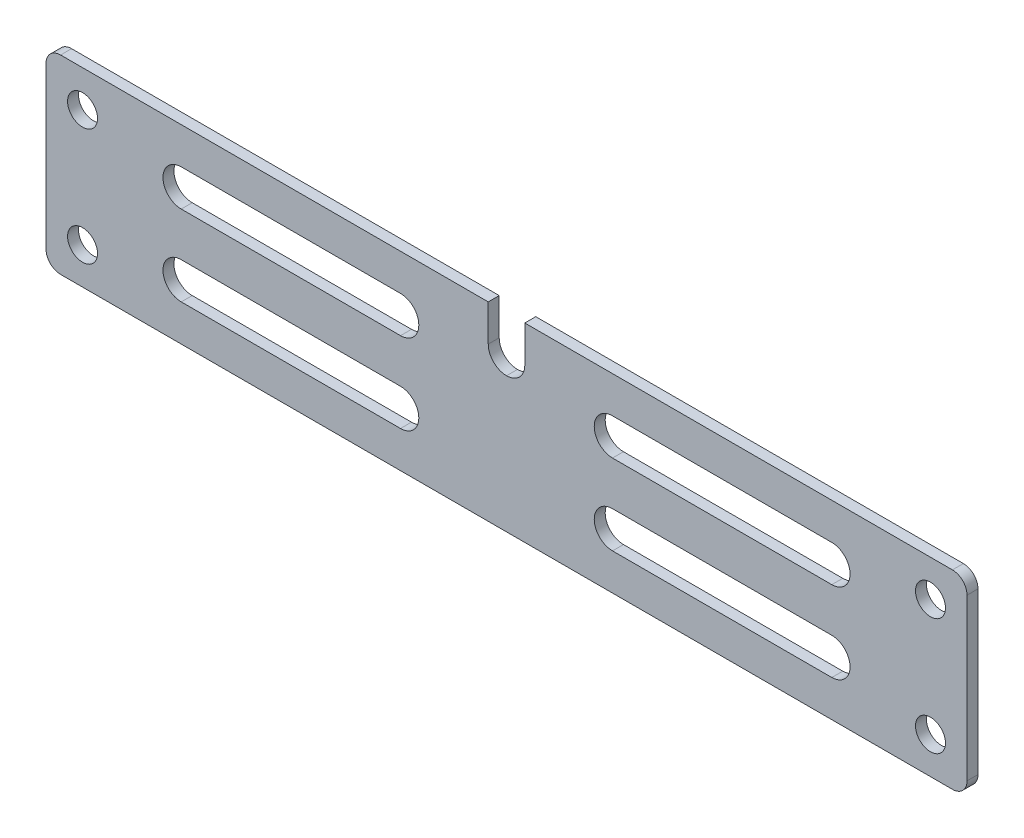
ISO-10303-21;
HEADER;
FILE_DESCRIPTION(('STEP AP214'),'2;1');
FILE_NAME('part.step','',(''),(''),'','','');
FILE_SCHEMA(('AUTOMOTIVE_DESIGN { 1 0 10303 214 1 1 1 1 }'));
ENDSEC;
DATA;
#1=APPLICATION_CONTEXT('core data for automotive mechanical design processes');
#2=APPLICATION_PROTOCOL_DEFINITION('international standard','automotive_design',2000,#1);
#3=PRODUCT_CONTEXT('',#1,'mechanical');
#4=PRODUCT('Part','Part','',(#3));
#5=PRODUCT_RELATED_PRODUCT_CATEGORY('part','',(#4));
#6=PRODUCT_DEFINITION_FORMATION('','',#4);
#7=PRODUCT_DEFINITION_CONTEXT('part definition',#1,'design');
#8=PRODUCT_DEFINITION('design','',#6,#7);
#9=PRODUCT_DEFINITION_SHAPE('','',#8);
#10=(LENGTH_UNIT() NAMED_UNIT(*) SI_UNIT(.MILLI.,.METRE.));
#11=(NAMED_UNIT(*) PLANE_ANGLE_UNIT() SI_UNIT($,.RADIAN.));
#12=(NAMED_UNIT(*) SI_UNIT($,.STERADIAN.) SOLID_ANGLE_UNIT());
#13=UNCERTAINTY_MEASURE_WITH_UNIT(LENGTH_MEASURE(1.E-05),#10,'distance_accuracy_value','');
#14=(GEOMETRIC_REPRESENTATION_CONTEXT(3) GLOBAL_UNCERTAINTY_ASSIGNED_CONTEXT((#13)) GLOBAL_UNIT_ASSIGNED_CONTEXT((#10,
#11,#12)) REPRESENTATION_CONTEXT('',''));
#15=CARTESIAN_POINT('',(0.,0.,0.));
#16=DIRECTION('',(0.,0.,1.));
#17=DIRECTION('',(1.,0.,0.));
#18=AXIS2_PLACEMENT_3D('',#15,#16,#17);
#19=CARTESIAN_POINT('',(63.,13.,1.5));
#20=DIRECTION('',(0.,-1.,0.));
#21=DIRECTION('',(1.,0.,0.));
#22=AXIS2_PLACEMENT_3D('',#19,#20,#21);
#23=PLANE('',#22);
#24=DIRECTION('',(-1.,0.,0.));
#25=VECTOR('',#24,1.);
#26=CARTESIAN_POINT('',(63.,13.,0.));
#27=LINE('',#26,#25);
#28=CARTESIAN_POINT('',(61.,13.,0.));
#29=VERTEX_POINT('',#28);
#30=CARTESIAN_POINT('',(2.5,13.,0.));
#31=VERTEX_POINT('',#30);
#32=EDGE_CURVE('E434',#29,#31,#27,.T.);
#33=ORIENTED_EDGE('',*,*,#32,.T.);
#34=DIRECTION('',(0.,0.,1.));
#35=VECTOR('',#34,1.);
#36=CARTESIAN_POINT('',(2.5,13.,1.5));
#37=LINE('',#36,#35);
#38=CARTESIAN_POINT('',(2.5,13.,1.5));
#39=VERTEX_POINT('',#38);
#40=EDGE_CURVE('E520',#31,#39,#37,.T.);
#41=ORIENTED_EDGE('',*,*,#40,.T.);
#42=DIRECTION('',(-1.,0.,0.));
#43=VECTOR('',#42,1.);
#44=CARTESIAN_POINT('',(63.,13.,1.5));
#45=LINE('',#44,#43);
#46=CARTESIAN_POINT('',(61.,13.,1.5));
#47=VERTEX_POINT('',#46);
#48=EDGE_CURVE('E441',#47,#39,#45,.T.);
#49=ORIENTED_EDGE('',*,*,#48,.F.);
#50=DIRECTION('',(0.,0.,-1.));
#51=VECTOR('',#50,1.);
#52=CARTESIAN_POINT('',(61.,13.,1.5));
#53=LINE('',#52,#51);
#54=EDGE_CURVE('E470',#47,#29,#53,.T.);
#55=ORIENTED_EDGE('',*,*,#54,.T.);
#56=EDGE_LOOP('',(#33,#41,#49,#55));
#57=FACE_BOUND('',#56,.T.);
#58=ADVANCED_FACE('F44',(#57),#23,.F.);
#59=CARTESIAN_POINT('',(-63.,-13.,1.5));
#60=DIRECTION('',(1.,0.,0.));
#61=DIRECTION('',(0.,0.,-1.));
#62=AXIS2_PLACEMENT_3D('',#59,#60,#61);
#63=PLANE('',#62);
#64=DIRECTION('',(0.,-1.,0.));
#65=VECTOR('',#64,1.);
#66=CARTESIAN_POINT('',(-63.,-13.,0.));
#67=LINE('',#66,#65);
#68=CARTESIAN_POINT('',(-63.,11.,0.));
#69=VERTEX_POINT('',#68);
#70=CARTESIAN_POINT('',(-63.,-11.,0.));
#71=VERTEX_POINT('',#70);
#72=EDGE_CURVE('E425',#69,#71,#67,.T.);
#73=ORIENTED_EDGE('',*,*,#72,.T.);
#74=DIRECTION('',(0.,0.,-1.));
#75=VECTOR('',#74,1.);
#76=CARTESIAN_POINT('',(-63.,-11.,1.5));
#77=LINE('',#76,#75);
#78=CARTESIAN_POINT('',(-63.,-11.,1.5));
#79=VERTEX_POINT('',#78);
#80=EDGE_CURVE('E416',#71,#79,#77,.F.);
#81=ORIENTED_EDGE('',*,*,#80,.T.);
#82=DIRECTION('',(0.,-1.,0.));
#83=VECTOR('',#82,1.);
#84=CARTESIAN_POINT('',(-63.,-13.,1.5));
#85=LINE('',#84,#83);
#86=CARTESIAN_POINT('',(-63.,11.,1.5));
#87=VERTEX_POINT('',#86);
#88=EDGE_CURVE('E429',#87,#79,#85,.T.);
#89=ORIENTED_EDGE('',*,*,#88,.F.);
#90=DIRECTION('',(0.,0.,-1.));
#91=VECTOR('',#90,1.);
#92=CARTESIAN_POINT('',(-63.,11.,1.5));
#93=LINE('',#92,#91);
#94=EDGE_CURVE('E509',#87,#69,#93,.T.);
#95=ORIENTED_EDGE('',*,*,#94,.T.);
#96=EDGE_LOOP('',(#73,#81,#89,#95));
#97=FACE_BOUND('',#96,.T.);
#98=ADVANCED_FACE('F594',(#97),#63,.F.);
#99=CARTESIAN_POINT('',(63.,-13.,1.5));
#100=DIRECTION('',(0.,1.,0.));
#101=DIRECTION('',(-1.,0.,0.));
#102=AXIS2_PLACEMENT_3D('',#99,#100,#101);
#103=PLANE('',#102);
#104=DIRECTION('',(1.,0.,0.));
#105=VECTOR('',#104,1.);
#106=CARTESIAN_POINT('',(63.,-13.,0.));
#107=LINE('',#106,#105);
#108=CARTESIAN_POINT('',(-61.,-13.,0.));
#109=VERTEX_POINT('',#108);
#110=CARTESIAN_POINT('',(61.,-13.,0.));
#111=VERTEX_POINT('',#110);
#112=EDGE_CURVE('E455',#109,#111,#107,.T.);
#113=ORIENTED_EDGE('',*,*,#112,.T.);
#114=DIRECTION('',(0.,0.,-1.));
#115=VECTOR('',#114,1.);
#116=CARTESIAN_POINT('',(61.,-13.,1.5));
#117=LINE('',#116,#115);
#118=CARTESIAN_POINT('',(61.,-13.,1.5));
#119=VERTEX_POINT('',#118);
#120=EDGE_CURVE('E510',#111,#119,#117,.F.);
#121=ORIENTED_EDGE('',*,*,#120,.T.);
#122=DIRECTION('',(1.,0.,0.));
#123=VECTOR('',#122,1.);
#124=CARTESIAN_POINT('',(63.,-13.,1.5));
#125=LINE('',#124,#123);
#126=CARTESIAN_POINT('',(-61.,-13.,1.5));
#127=VERTEX_POINT('',#126);
#128=EDGE_CURVE('E432',#127,#119,#125,.T.);
#129=ORIENTED_EDGE('',*,*,#128,.F.);
#130=DIRECTION('',(0.,0.,-1.));
#131=VECTOR('',#130,1.);
#132=CARTESIAN_POINT('',(-61.,-13.,1.5));
#133=LINE('',#132,#131);
#134=EDGE_CURVE('E502',#127,#109,#133,.T.);
#135=ORIENTED_EDGE('',*,*,#134,.T.);
#136=EDGE_LOOP('',(#113,#121,#129,#135));
#137=FACE_BOUND('',#136,.T.);
#138=ADVANCED_FACE('F588',(#137),#103,.F.);
#139=CARTESIAN_POINT('',(63.,-13.,1.5));
#140=DIRECTION('',(-1.,0.,0.));
#141=DIRECTION('',(0.,0.,1.));
#142=AXIS2_PLACEMENT_3D('',#139,#140,#141);
#143=PLANE('',#142);
#144=DIRECTION('',(0.,1.,0.));
#145=VECTOR('',#144,1.);
#146=CARTESIAN_POINT('',(63.,-13.,0.));
#147=LINE('',#146,#145);
#148=CARTESIAN_POINT('',(63.,-11.,0.));
#149=VERTEX_POINT('',#148);
#150=CARTESIAN_POINT('',(63.,11.,0.));
#151=VERTEX_POINT('',#150);
#152=EDGE_CURVE('E457',#149,#151,#147,.T.);
#153=ORIENTED_EDGE('',*,*,#152,.T.);
#154=DIRECTION('',(0.,0.,-1.));
#155=VECTOR('',#154,1.);
#156=CARTESIAN_POINT('',(63.,11.,1.5));
#157=LINE('',#156,#155);
#158=CARTESIAN_POINT('',(63.,11.,1.5));
#159=VERTEX_POINT('',#158);
#160=EDGE_CURVE('E488',#151,#159,#157,.F.);
#161=ORIENTED_EDGE('',*,*,#160,.T.);
#162=DIRECTION('',(0.,1.,0.));
#163=VECTOR('',#162,1.);
#164=CARTESIAN_POINT('',(63.,-13.,1.5));
#165=LINE('',#164,#163);
#166=CARTESIAN_POINT('',(63.,-11.,1.5));
#167=VERTEX_POINT('',#166);
#168=EDGE_CURVE('E438',#167,#159,#165,.T.);
#169=ORIENTED_EDGE('',*,*,#168,.F.);
#170=DIRECTION('',(0.,0.,-1.));
#171=VECTOR('',#170,1.);
#172=CARTESIAN_POINT('',(63.,-11.,1.5));
#173=LINE('',#172,#171);
#174=EDGE_CURVE('E482',#167,#149,#173,.T.);
#175=ORIENTED_EDGE('',*,*,#174,.T.);
#176=EDGE_LOOP('',(#153,#161,#169,#175));
#177=FACE_BOUND('',#176,.T.);
#178=ADVANCED_FACE('F580',(#177),#143,.F.);
#179=CARTESIAN_POINT('',(-2.5,13.,1.5));
#180=VERTEX_POINT('',#179);
#181=CARTESIAN_POINT('',(-61.,13.,1.5));
#182=VERTEX_POINT('',#181);
#183=EDGE_CURVE('E444',#180,#182,#45,.T.);
#184=ORIENTED_EDGE('',*,*,#183,.F.);
#185=DIRECTION('',(0.,0.,-1.));
#186=VECTOR('',#185,1.);
#187=CARTESIAN_POINT('',(-2.5,13.,1.5));
#188=LINE('',#187,#186);
#189=CARTESIAN_POINT('',(-2.5,13.,0.));
#190=VERTEX_POINT('',#189);
#191=EDGE_CURVE('E430',#180,#190,#188,.T.);
#192=ORIENTED_EDGE('',*,*,#191,.T.);
#193=CARTESIAN_POINT('',(-61.,13.,0.));
#194=VERTEX_POINT('',#193);
#195=EDGE_CURVE('E458',#190,#194,#27,.T.);
#196=ORIENTED_EDGE('',*,*,#195,.T.);
#197=DIRECTION('',(0.,0.,-1.));
#198=VECTOR('',#197,1.);
#199=CARTESIAN_POINT('',(-61.,13.,1.5));
#200=LINE('',#199,#198);
#201=EDGE_CURVE('E447',#194,#182,#200,.F.);
#202=ORIENTED_EDGE('',*,*,#201,.T.);
#203=EDGE_LOOP('',(#184,#192,#196,#202));
#204=FACE_BOUND('',#203,.T.);
#205=ADVANCED_FACE('F553',(#204),#23,.F.);
#206=CARTESIAN_POINT('',(0.,0.,1.5));
#207=DIRECTION('',(0.,0.,1.));
#208=DIRECTION('',(1.,0.,0.));
#209=AXIS2_PLACEMENT_3D('',#206,#207,#208);
#210=PLANE('',#209);
#211=CARTESIAN_POINT('',(-58.,-7.99999999999999,1.5));
#212=DIRECTION('',(0.,0.,1.));
#213=DIRECTION('',(1.,0.,0.));
#214=AXIS2_PLACEMENT_3D('',#211,#212,#213);
#215=CIRCLE('',#214,2.05);
#216=CARTESIAN_POINT('',(-55.95,-7.99999999999999,1.5));
#217=VERTEX_POINT('',#216);
#218=EDGE_CURVE('E930',#217,#217,#215,.T.);
#219=ORIENTED_EDGE('',*,*,#218,.F.);
#220=EDGE_LOOP('',(#219));
#221=FACE_BOUND('',#220,.T.);
#222=CARTESIAN_POINT('',(-58.,7.99999999999997,1.5));
#223=DIRECTION('',(0.,0.,1.));
#224=DIRECTION('',(1.,0.,0.));
#225=AXIS2_PLACEMENT_3D('',#222,#223,#224);
#226=CIRCLE('',#225,2.05);
#227=CARTESIAN_POINT('',(-55.95,7.99999999999997,1.5));
#228=VERTEX_POINT('',#227);
#229=EDGE_CURVE('E932',#228,#228,#226,.T.);
#230=ORIENTED_EDGE('',*,*,#229,.F.);
#231=EDGE_LOOP('',(#230));
#232=FACE_BOUND('',#231,.T.);
#233=CARTESIAN_POINT('',(58.,8.,1.5));
#234=DIRECTION('',(0.,0.,1.));
#235=DIRECTION('',(1.,0.,0.));
#236=AXIS2_PLACEMENT_3D('',#233,#234,#235);
#237=CIRCLE('',#236,2.05);
#238=CARTESIAN_POINT('',(60.05,8.,1.5));
#239=VERTEX_POINT('',#238);
#240=EDGE_CURVE('E925',#239,#239,#237,.T.);
#241=ORIENTED_EDGE('',*,*,#240,.F.);
#242=EDGE_LOOP('',(#241));
#243=FACE_BOUND('',#242,.T.);
#244=CARTESIAN_POINT('',(58.,-7.99999999999999,1.5));
#245=DIRECTION('',(0.,0.,1.));
#246=DIRECTION('',(1.,0.,0.));
#247=AXIS2_PLACEMENT_3D('',#244,#245,#246);
#248=CIRCLE('',#247,2.05);
#249=CARTESIAN_POINT('',(60.05,-7.99999999999999,1.5));
#250=VERTEX_POINT('',#249);
#251=EDGE_CURVE('E916',#250,#250,#248,.T.);
#252=ORIENTED_EDGE('',*,*,#251,.F.);
#253=EDGE_LOOP('',(#252));
#254=FACE_BOUND('',#253,.T.);
#255=CARTESIAN_POINT('',(-44.5,-5.5,1.5));
#256=DIRECTION('',(0.,0.,1.));
#257=DIRECTION('',(1.,0.,0.));
#258=AXIS2_PLACEMENT_3D('',#255,#256,#257);
#259=CIRCLE('',#258,2.5);
#260=CARTESIAN_POINT('',(-44.5,-3.,1.5));
#261=VERTEX_POINT('',#260);
#262=CARTESIAN_POINT('',(-44.5,-8.,1.5));
#263=VERTEX_POINT('',#262);
#264=EDGE_CURVE('E64',#261,#263,#259,.T.);
#265=ORIENTED_EDGE('',*,*,#264,.F.);
#266=DIRECTION('',(-1.,0.,0.));
#267=VECTOR('',#266,1.);
#268=CARTESIAN_POINT('',(-44.5,-3.,1.5));
#269=LINE('',#268,#267);
#270=CARTESIAN_POINT('',(-14.5,-3.,1.5));
#271=VERTEX_POINT('',#270);
#272=EDGE_CURVE('E342',#271,#261,#269,.T.);
#273=ORIENTED_EDGE('',*,*,#272,.F.);
#274=CARTESIAN_POINT('',(-14.5,-5.5,1.5));
#275=DIRECTION('',(0.,0.,1.));
#276=DIRECTION('',(1.,0.,0.));
#277=AXIS2_PLACEMENT_3D('',#274,#275,#276);
#278=CIRCLE('',#277,2.5);
#279=CARTESIAN_POINT('',(-14.5,-8.,1.5));
#280=VERTEX_POINT('',#279);
#281=EDGE_CURVE('E346',#280,#271,#278,.T.);
#282=ORIENTED_EDGE('',*,*,#281,.F.);
#283=DIRECTION('',(1.,0.,0.));
#284=VECTOR('',#283,1.);
#285=CARTESIAN_POINT('',(-44.5,-8.,1.5));
#286=LINE('',#285,#284);
#287=EDGE_CURVE('E352',#263,#280,#286,.T.);
#288=ORIENTED_EDGE('',*,*,#287,.F.);
#289=EDGE_LOOP('',(#265,#273,#282,#288));
#290=FACE_BOUND('',#289,.T.);
#291=CARTESIAN_POINT('',(14.5,-5.5,1.5));
#292=DIRECTION('',(0.,0.,1.));
#293=DIRECTION('',(1.,0.,0.));
#294=AXIS2_PLACEMENT_3D('',#291,#292,#293);
#295=CIRCLE('',#294,2.5);
#296=CARTESIAN_POINT('',(14.5,-3.,1.5));
#297=VERTEX_POINT('',#296);
#298=CARTESIAN_POINT('',(14.5,-8.,1.5));
#299=VERTEX_POINT('',#298);
#300=EDGE_CURVE('E69',#297,#299,#295,.T.);
#301=ORIENTED_EDGE('',*,*,#300,.F.);
#302=DIRECTION('',(-1.,0.,0.));
#303=VECTOR('',#302,1.);
#304=CARTESIAN_POINT('',(14.5,-3.,1.5));
#305=LINE('',#304,#303);
#306=CARTESIAN_POINT('',(44.5,-3.,1.5));
#307=VERTEX_POINT('',#306);
#308=EDGE_CURVE('E303',#307,#297,#305,.T.);
#309=ORIENTED_EDGE('',*,*,#308,.F.);
#310=CARTESIAN_POINT('',(44.5,-5.5,1.5));
#311=DIRECTION('',(0.,0.,1.));
#312=DIRECTION('',(1.,0.,0.));
#313=AXIS2_PLACEMENT_3D('',#310,#311,#312);
#314=CIRCLE('',#313,2.5);
#315=CARTESIAN_POINT('',(44.5,-8.,1.5));
#316=VERTEX_POINT('',#315);
#317=EDGE_CURVE('E304',#316,#307,#314,.T.);
#318=ORIENTED_EDGE('',*,*,#317,.F.);
#319=DIRECTION('',(1.,0.,0.));
#320=VECTOR('',#319,1.);
#321=CARTESIAN_POINT('',(14.5,-8.,1.5));
#322=LINE('',#321,#320);
#323=EDGE_CURVE('E309',#299,#316,#322,.T.);
#324=ORIENTED_EDGE('',*,*,#323,.F.);
#325=EDGE_LOOP('',(#301,#309,#318,#324));
#326=FACE_BOUND('',#325,.T.);
#327=CARTESIAN_POINT('',(14.5,5.5,1.5));
#328=DIRECTION('',(0.,0.,1.));
#329=DIRECTION('',(1.,0.,0.));
#330=AXIS2_PLACEMENT_3D('',#327,#328,#329);
#331=CIRCLE('',#330,2.5);
#332=CARTESIAN_POINT('',(14.5,8.,1.5));
#333=VERTEX_POINT('',#332);
#334=CARTESIAN_POINT('',(14.5,3.,1.5));
#335=VERTEX_POINT('',#334);
#336=EDGE_CURVE('E238',#333,#335,#331,.T.);
#337=ORIENTED_EDGE('',*,*,#336,.F.);
#338=DIRECTION('',(-1.,0.,0.));
#339=VECTOR('',#338,1.);
#340=CARTESIAN_POINT('',(14.5,8.,1.5));
#341=LINE('',#340,#339);
#342=CARTESIAN_POINT('',(44.5,8.,1.5));
#343=VERTEX_POINT('',#342);
#344=EDGE_CURVE('E253',#343,#333,#341,.T.);
#345=ORIENTED_EDGE('',*,*,#344,.F.);
#346=CARTESIAN_POINT('',(44.5,5.5,1.5));
#347=DIRECTION('',(0.,0.,1.));
#348=DIRECTION('',(1.,0.,0.));
#349=AXIS2_PLACEMENT_3D('',#346,#347,#348);
#350=CIRCLE('',#349,2.5);
#351=CARTESIAN_POINT('',(44.5,3.,1.5));
#352=VERTEX_POINT('',#351);
#353=EDGE_CURVE('E260',#352,#343,#350,.T.);
#354=ORIENTED_EDGE('',*,*,#353,.F.);
#355=DIRECTION('',(1.,0.,0.));
#356=VECTOR('',#355,1.);
#357=CARTESIAN_POINT('',(14.5,3.,1.5));
#358=LINE('',#357,#356);
#359=EDGE_CURVE('E263',#335,#352,#358,.T.);
#360=ORIENTED_EDGE('',*,*,#359,.F.);
#361=EDGE_LOOP('',(#337,#345,#354,#360));
#362=FACE_BOUND('',#361,.T.);
#363=CARTESIAN_POINT('',(-44.5,5.5,1.5));
#364=DIRECTION('',(0.,0.,1.));
#365=DIRECTION('',(1.,0.,0.));
#366=AXIS2_PLACEMENT_3D('',#363,#364,#365);
#367=CIRCLE('',#366,2.5);
#368=CARTESIAN_POINT('',(-44.5,8.,1.5));
#369=VERTEX_POINT('',#368);
#370=CARTESIAN_POINT('',(-44.5,3.,1.5));
#371=VERTEX_POINT('',#370);
#372=EDGE_CURVE('E264',#369,#371,#367,.T.);
#373=ORIENTED_EDGE('',*,*,#372,.F.);
#374=DIRECTION('',(-1.,0.,0.));
#375=VECTOR('',#374,1.);
#376=CARTESIAN_POINT('',(-44.5,8.,1.5));
#377=LINE('',#376,#375);
#378=CARTESIAN_POINT('',(-14.5,8.,1.5));
#379=VERTEX_POINT('',#378);
#380=EDGE_CURVE('E378',#379,#369,#377,.T.);
#381=ORIENTED_EDGE('',*,*,#380,.F.);
#382=CARTESIAN_POINT('',(-14.5,5.5,1.5));
#383=DIRECTION('',(0.,0.,1.));
#384=DIRECTION('',(1.,0.,0.));
#385=AXIS2_PLACEMENT_3D('',#382,#383,#384);
#386=CIRCLE('',#385,2.5);
#387=CARTESIAN_POINT('',(-14.5,3.,1.5));
#388=VERTEX_POINT('',#387);
#389=EDGE_CURVE('E395',#388,#379,#386,.T.);
#390=ORIENTED_EDGE('',*,*,#389,.F.);
#391=DIRECTION('',(1.,0.,0.));
#392=VECTOR('',#391,1.);
#393=CARTESIAN_POINT('',(-44.5,3.,1.5));
#394=LINE('',#393,#392);
#395=EDGE_CURVE('E267',#371,#388,#394,.T.);
#396=ORIENTED_EDGE('',*,*,#395,.F.);
#397=EDGE_LOOP('',(#373,#381,#390,#396));
#398=FACE_BOUND('',#397,.T.);
#399=DIRECTION('',(0.,-1.,0.));
#400=VECTOR('',#399,1.);
#401=CARTESIAN_POINT('',(-2.5,5.50000000000002,1.5));
#402=LINE('',#401,#400);
#403=CARTESIAN_POINT('',(-2.5,8.00000000000002,1.5));
#404=VERTEX_POINT('',#403);
#405=EDGE_CURVE('E417',#180,#404,#402,.T.);
#406=ORIENTED_EDGE('',*,*,#405,.F.);
#407=ORIENTED_EDGE('',*,*,#183,.T.);
#408=CARTESIAN_POINT('',(-61.,11.,1.5));
#409=DIRECTION('',(0.,0.,1.));
#410=DIRECTION('',(1.,0.,0.));
#411=AXIS2_PLACEMENT_3D('',#408,#409,#410);
#412=CIRCLE('',#411,2.);
#413=EDGE_CURVE('E491',#182,#87,#412,.T.);
#414=ORIENTED_EDGE('',*,*,#413,.T.);
#415=ORIENTED_EDGE('',*,*,#88,.T.);
#416=CARTESIAN_POINT('',(-61.,-11.,1.5));
#417=DIRECTION('',(0.,0.,1.));
#418=DIRECTION('',(1.,0.,0.));
#419=AXIS2_PLACEMENT_3D('',#416,#417,#418);
#420=CIRCLE('',#419,2.);
#421=EDGE_CURVE('E493',#79,#127,#420,.T.);
#422=ORIENTED_EDGE('',*,*,#421,.T.);
#423=ORIENTED_EDGE('',*,*,#128,.T.);
#424=CARTESIAN_POINT('',(61.,-11.,1.5));
#425=DIRECTION('',(0.,0.,1.));
#426=DIRECTION('',(1.,0.,0.));
#427=AXIS2_PLACEMENT_3D('',#424,#425,#426);
#428=CIRCLE('',#427,2.);
#429=EDGE_CURVE('E500',#119,#167,#428,.T.);
#430=ORIENTED_EDGE('',*,*,#429,.T.);
#431=ORIENTED_EDGE('',*,*,#168,.T.);
#432=CARTESIAN_POINT('',(61.,11.,1.5));
#433=DIRECTION('',(0.,0.,1.));
#434=DIRECTION('',(1.,0.,0.));
#435=AXIS2_PLACEMENT_3D('',#432,#433,#434);
#436=CIRCLE('',#435,2.);
#437=EDGE_CURVE('E498',#159,#47,#436,.T.);
#438=ORIENTED_EDGE('',*,*,#437,.T.);
#439=ORIENTED_EDGE('',*,*,#48,.T.);
#440=DIRECTION('',(0.,1.,0.));
#441=VECTOR('',#440,1.);
#442=CARTESIAN_POINT('',(2.5,5.50000000000002,1.5));
#443=LINE('',#442,#441);
#444=CARTESIAN_POINT('',(2.5,8.00000000000002,1.5));
#445=VERTEX_POINT('',#444);
#446=EDGE_CURVE('E421',#445,#39,#443,.T.);
#447=ORIENTED_EDGE('',*,*,#446,.F.);
#448=CARTESIAN_POINT('',(0.,8.00000000000002,1.5));
#449=DIRECTION('',(0.,0.,1.));
#450=DIRECTION('',(1.,0.,0.));
#451=AXIS2_PLACEMENT_3D('',#448,#449,#450);
#452=CIRCLE('',#451,2.5);
#453=CARTESIAN_POINT('',(0.,5.50000000000002,1.5));
#454=VERTEX_POINT('',#453);
#455=EDGE_CURVE('E529',#445,#454,#452,.F.);
#456=ORIENTED_EDGE('',*,*,#455,.T.);
#457=CARTESIAN_POINT('',(0.,8.00000000000002,1.5));
#458=DIRECTION('',(0.,0.,1.));
#459=DIRECTION('',(1.,0.,0.));
#460=AXIS2_PLACEMENT_3D('',#457,#458,#459);
#461=CIRCLE('',#460,2.5);
#462=EDGE_CURVE('E54',#454,#404,#461,.F.);
#463=ORIENTED_EDGE('',*,*,#462,.T.);
#464=EDGE_LOOP('',(#406,#407,#414,#415,#422,#423,#430,#431,#438,#439,#447,#456,#463));
#465=FACE_BOUND('',#464,.T.);
#466=ADVANCED_FACE('F257',(#221,#232,#243,#254,#290,#326,#362,#398,#465),#210,.T.);
#467=CARTESIAN_POINT('',(0.,0.,0.));
#468=DIRECTION('',(0.,0.,1.));
#469=DIRECTION('',(1.,0.,0.));
#470=AXIS2_PLACEMENT_3D('',#467,#468,#469);
#471=PLANE('',#470);
#472=CARTESIAN_POINT('',(-58.,-7.99999999999999,0.));
#473=DIRECTION('',(0.,0.,1.));
#474=DIRECTION('',(1.,0.,0.));
#475=AXIS2_PLACEMENT_3D('',#472,#473,#474);
#476=CIRCLE('',#475,2.05);
#477=CARTESIAN_POINT('',(-55.95,-7.99999999999999,0.));
#478=VERTEX_POINT('',#477);
#479=EDGE_CURVE('E885',#478,#478,#476,.T.);
#480=ORIENTED_EDGE('',*,*,#479,.T.);
#481=EDGE_LOOP('',(#480));
#482=FACE_BOUND('',#481,.T.);
#483=CARTESIAN_POINT('',(-58.,7.99999999999997,0.));
#484=DIRECTION('',(0.,0.,1.));
#485=DIRECTION('',(1.,0.,0.));
#486=AXIS2_PLACEMENT_3D('',#483,#484,#485);
#487=CIRCLE('',#486,2.05);
#488=CARTESIAN_POINT('',(-55.95,7.99999999999997,0.));
#489=VERTEX_POINT('',#488);
#490=EDGE_CURVE('E888',#489,#489,#487,.T.);
#491=ORIENTED_EDGE('',*,*,#490,.T.);
#492=EDGE_LOOP('',(#491));
#493=FACE_BOUND('',#492,.T.);
#494=CARTESIAN_POINT('',(58.,8.,0.));
#495=DIRECTION('',(0.,0.,1.));
#496=DIRECTION('',(1.,0.,0.));
#497=AXIS2_PLACEMENT_3D('',#494,#495,#496);
#498=CIRCLE('',#497,2.05);
#499=CARTESIAN_POINT('',(60.05,8.,0.));
#500=VERTEX_POINT('',#499);
#501=EDGE_CURVE('E886',#500,#500,#498,.T.);
#502=ORIENTED_EDGE('',*,*,#501,.T.);
#503=EDGE_LOOP('',(#502));
#504=FACE_BOUND('',#503,.T.);
#505=CARTESIAN_POINT('',(58.,-7.99999999999999,0.));
#506=DIRECTION('',(0.,0.,1.));
#507=DIRECTION('',(1.,0.,0.));
#508=AXIS2_PLACEMENT_3D('',#505,#506,#507);
#509=CIRCLE('',#508,2.05);
#510=CARTESIAN_POINT('',(60.05,-7.99999999999999,0.));
#511=VERTEX_POINT('',#510);
#512=EDGE_CURVE('E341',#511,#511,#509,.T.);
#513=ORIENTED_EDGE('',*,*,#512,.T.);
#514=EDGE_LOOP('',(#513));
#515=FACE_BOUND('',#514,.T.);
#516=DIRECTION('',(-1.,0.,0.));
#517=VECTOR('',#516,1.);
#518=CARTESIAN_POINT('',(-44.5,-3.,0.));
#519=LINE('',#518,#517);
#520=CARTESIAN_POINT('',(-14.5,-3.,0.));
#521=VERTEX_POINT('',#520);
#522=CARTESIAN_POINT('',(-44.5,-3.,0.));
#523=VERTEX_POINT('',#522);
#524=EDGE_CURVE('E334',#521,#523,#519,.T.);
#525=ORIENTED_EDGE('',*,*,#524,.T.);
#526=CARTESIAN_POINT('',(-44.5,-5.5,0.));
#527=DIRECTION('',(0.,0.,1.));
#528=DIRECTION('',(1.,0.,0.));
#529=AXIS2_PLACEMENT_3D('',#526,#527,#528);
#530=CIRCLE('',#529,2.5);
#531=CARTESIAN_POINT('',(-44.5,-8.,0.));
#532=VERTEX_POINT('',#531);
#533=EDGE_CURVE('E349',#523,#532,#530,.T.);
#534=ORIENTED_EDGE('',*,*,#533,.T.);
#535=DIRECTION('',(1.,0.,0.));
#536=VECTOR('',#535,1.);
#537=CARTESIAN_POINT('',(-44.5,-8.,0.));
#538=LINE('',#537,#536);
#539=CARTESIAN_POINT('',(-14.5,-8.,0.));
#540=VERTEX_POINT('',#539);
#541=EDGE_CURVE('E368',#532,#540,#538,.T.);
#542=ORIENTED_EDGE('',*,*,#541,.T.);
#543=CARTESIAN_POINT('',(-14.5,-5.5,0.));
#544=DIRECTION('',(0.,0.,1.));
#545=DIRECTION('',(1.,0.,0.));
#546=AXIS2_PLACEMENT_3D('',#543,#544,#545);
#547=CIRCLE('',#546,2.5);
#548=EDGE_CURVE('E362',#540,#521,#547,.T.);
#549=ORIENTED_EDGE('',*,*,#548,.T.);
#550=EDGE_LOOP('',(#525,#534,#542,#549));
#551=FACE_BOUND('',#550,.T.);
#552=DIRECTION('',(-1.,0.,0.));
#553=VECTOR('',#552,1.);
#554=CARTESIAN_POINT('',(14.5,-3.,0.));
#555=LINE('',#554,#553);
#556=CARTESIAN_POINT('',(44.5,-3.,0.));
#557=VERTEX_POINT('',#556);
#558=CARTESIAN_POINT('',(14.5,-3.,0.));
#559=VERTEX_POINT('',#558);
#560=EDGE_CURVE('E292',#557,#559,#555,.T.);
#561=ORIENTED_EDGE('',*,*,#560,.T.);
#562=CARTESIAN_POINT('',(14.5,-5.5,0.));
#563=DIRECTION('',(0.,0.,1.));
#564=DIRECTION('',(1.,0.,0.));
#565=AXIS2_PLACEMENT_3D('',#562,#563,#564);
#566=CIRCLE('',#565,2.5);
#567=CARTESIAN_POINT('',(14.5,-8.,0.));
#568=VERTEX_POINT('',#567);
#569=EDGE_CURVE('E308',#559,#568,#566,.T.);
#570=ORIENTED_EDGE('',*,*,#569,.T.);
#571=DIRECTION('',(1.,0.,0.));
#572=VECTOR('',#571,1.);
#573=CARTESIAN_POINT('',(14.5,-8.,0.));
#574=LINE('',#573,#572);
#575=CARTESIAN_POINT('',(44.5,-8.,0.));
#576=VERTEX_POINT('',#575);
#577=EDGE_CURVE('E323',#568,#576,#574,.T.);
#578=ORIENTED_EDGE('',*,*,#577,.T.);
#579=CARTESIAN_POINT('',(44.5,-5.5,0.));
#580=DIRECTION('',(0.,0.,1.));
#581=DIRECTION('',(1.,0.,0.));
#582=AXIS2_PLACEMENT_3D('',#579,#580,#581);
#583=CIRCLE('',#582,2.5);
#584=EDGE_CURVE('E317',#576,#557,#583,.T.);
#585=ORIENTED_EDGE('',*,*,#584,.T.);
#586=EDGE_LOOP('',(#561,#570,#578,#585));
#587=FACE_BOUND('',#586,.T.);
#588=DIRECTION('',(-1.,0.,0.));
#589=VECTOR('',#588,1.);
#590=CARTESIAN_POINT('',(14.5,8.,0.));
#591=LINE('',#590,#589);
#592=CARTESIAN_POINT('',(44.5,8.,0.));
#593=VERTEX_POINT('',#592);
#594=CARTESIAN_POINT('',(14.5,8.,0.));
#595=VERTEX_POINT('',#594);
#596=EDGE_CURVE('E273',#593,#595,#591,.T.);
#597=ORIENTED_EDGE('',*,*,#596,.T.);
#598=CARTESIAN_POINT('',(14.5,5.5,0.));
#599=DIRECTION('',(0.,0.,1.));
#600=DIRECTION('',(1.,0.,0.));
#601=AXIS2_PLACEMENT_3D('',#598,#599,#600);
#602=CIRCLE('',#601,2.5);
#603=CARTESIAN_POINT('',(14.5,3.,0.));
#604=VERTEX_POINT('',#603);
#605=EDGE_CURVE('E242',#595,#604,#602,.T.);
#606=ORIENTED_EDGE('',*,*,#605,.T.);
#607=DIRECTION('',(1.,0.,0.));
#608=VECTOR('',#607,1.);
#609=CARTESIAN_POINT('',(14.5,3.,0.));
#610=LINE('',#609,#608);
#611=CARTESIAN_POINT('',(44.5,3.,0.));
#612=VERTEX_POINT('',#611);
#613=EDGE_CURVE('E284',#604,#612,#610,.T.);
#614=ORIENTED_EDGE('',*,*,#613,.T.);
#615=CARTESIAN_POINT('',(44.5,5.5,0.));
#616=DIRECTION('',(0.,0.,1.));
#617=DIRECTION('',(1.,0.,0.));
#618=AXIS2_PLACEMENT_3D('',#615,#616,#617);
#619=CIRCLE('',#618,2.5);
#620=EDGE_CURVE('E280',#612,#593,#619,.T.);
#621=ORIENTED_EDGE('',*,*,#620,.T.);
#622=EDGE_LOOP('',(#597,#606,#614,#621));
#623=FACE_BOUND('',#622,.T.);
#624=DIRECTION('',(-1.,0.,0.));
#625=VECTOR('',#624,1.);
#626=CARTESIAN_POINT('',(-44.5,8.,0.));
#627=LINE('',#626,#625);
#628=CARTESIAN_POINT('',(-14.5,8.,0.));
#629=VERTEX_POINT('',#628);
#630=CARTESIAN_POINT('',(-44.5,8.,0.));
#631=VERTEX_POINT('',#630);
#632=EDGE_CURVE('E387',#629,#631,#627,.T.);
#633=ORIENTED_EDGE('',*,*,#632,.T.);
#634=CARTESIAN_POINT('',(-44.5,5.5,0.));
#635=DIRECTION('',(0.,0.,1.));
#636=DIRECTION('',(1.,0.,0.));
#637=AXIS2_PLACEMENT_3D('',#634,#635,#636);
#638=CIRCLE('',#637,2.5);
#639=CARTESIAN_POINT('',(-44.5,3.,0.));
#640=VERTEX_POINT('',#639);
#641=EDGE_CURVE('E373',#631,#640,#638,.T.);
#642=ORIENTED_EDGE('',*,*,#641,.T.);
#643=DIRECTION('',(1.,0.,0.));
#644=VECTOR('',#643,1.);
#645=CARTESIAN_POINT('',(-44.5,3.,0.));
#646=LINE('',#645,#644);
#647=CARTESIAN_POINT('',(-14.5,3.,0.));
#648=VERTEX_POINT('',#647);
#649=EDGE_CURVE('E380',#640,#648,#646,.T.);
#650=ORIENTED_EDGE('',*,*,#649,.T.);
#651=CARTESIAN_POINT('',(-14.5,5.5,0.));
#652=DIRECTION('',(0.,0.,1.));
#653=DIRECTION('',(1.,0.,0.));
#654=AXIS2_PLACEMENT_3D('',#651,#652,#653);
#655=CIRCLE('',#654,2.5);
#656=EDGE_CURVE('E385',#648,#629,#655,.T.);
#657=ORIENTED_EDGE('',*,*,#656,.T.);
#658=EDGE_LOOP('',(#633,#642,#650,#657));
#659=FACE_BOUND('',#658,.T.);
#660=DIRECTION('',(0.,-1.,0.));
#661=VECTOR('',#660,1.);
#662=CARTESIAN_POINT('',(-2.5,5.50000000000002,0.));
#663=LINE('',#662,#661);
#664=CARTESIAN_POINT('',(-2.5,8.00000000000002,0.));
#665=VERTEX_POINT('',#664);
#666=EDGE_CURVE('E411',#190,#665,#663,.T.);
#667=ORIENTED_EDGE('',*,*,#666,.T.);
#668=CARTESIAN_POINT('',(0.,8.00000000000002,0.));
#669=DIRECTION('',(0.,0.,1.));
#670=DIRECTION('',(1.,0.,0.));
#671=AXIS2_PLACEMENT_3D('',#668,#669,#670);
#672=CIRCLE('',#671,2.5);
#673=CARTESIAN_POINT('',(0.,5.50000000000002,0.));
#674=VERTEX_POINT('',#673);
#675=EDGE_CURVE('E11',#665,#674,#672,.T.);
#676=ORIENTED_EDGE('',*,*,#675,.T.);
#677=CARTESIAN_POINT('',(0.,8.00000000000002,0.));
#678=DIRECTION('',(0.,0.,1.));
#679=DIRECTION('',(1.,0.,0.));
#680=AXIS2_PLACEMENT_3D('',#677,#678,#679);
#681=CIRCLE('',#680,2.5);
#682=CARTESIAN_POINT('',(2.5,8.00000000000002,0.));
#683=VERTEX_POINT('',#682);
#684=EDGE_CURVE('E531',#674,#683,#681,.T.);
#685=ORIENTED_EDGE('',*,*,#684,.T.);
#686=DIRECTION('',(0.,1.,0.));
#687=VECTOR('',#686,1.);
#688=CARTESIAN_POINT('',(2.5,5.50000000000002,0.));
#689=LINE('',#688,#687);
#690=EDGE_CURVE('E420',#683,#31,#689,.T.);
#691=ORIENTED_EDGE('',*,*,#690,.T.);
#692=ORIENTED_EDGE('',*,*,#32,.F.);
#693=CARTESIAN_POINT('',(61.,11.,0.));
#694=DIRECTION('',(0.,0.,1.));
#695=DIRECTION('',(1.,0.,0.));
#696=AXIS2_PLACEMENT_3D('',#693,#694,#695);
#697=CIRCLE('',#696,2.);
#698=EDGE_CURVE('E481',#29,#151,#697,.F.);
#699=ORIENTED_EDGE('',*,*,#698,.T.);
#700=ORIENTED_EDGE('',*,*,#152,.F.);
#701=CARTESIAN_POINT('',(61.,-11.,0.));
#702=DIRECTION('',(0.,0.,1.));
#703=DIRECTION('',(1.,0.,0.));
#704=AXIS2_PLACEMENT_3D('',#701,#702,#703);
#705=CIRCLE('',#704,2.);
#706=EDGE_CURVE('E476',#149,#111,#705,.F.);
#707=ORIENTED_EDGE('',*,*,#706,.T.);
#708=ORIENTED_EDGE('',*,*,#112,.F.);
#709=CARTESIAN_POINT('',(-61.,-11.,0.));
#710=DIRECTION('',(0.,0.,1.));
#711=DIRECTION('',(1.,0.,0.));
#712=AXIS2_PLACEMENT_3D('',#709,#710,#711);
#713=CIRCLE('',#712,2.);
#714=EDGE_CURVE('E474',#109,#71,#713,.F.);
#715=ORIENTED_EDGE('',*,*,#714,.T.);
#716=ORIENTED_EDGE('',*,*,#72,.F.);
#717=CARTESIAN_POINT('',(-61.,11.,0.));
#718=DIRECTION('',(0.,0.,1.));
#719=DIRECTION('',(1.,0.,0.));
#720=AXIS2_PLACEMENT_3D('',#717,#718,#719);
#721=CIRCLE('',#720,2.);
#722=EDGE_CURVE('E473',#69,#194,#721,.F.);
#723=ORIENTED_EDGE('',*,*,#722,.T.);
#724=ORIENTED_EDGE('',*,*,#195,.F.);
#725=EDGE_LOOP('',(#667,#676,#685,#691,#692,#699,#700,#707,#708,#715,#716,#723,#724));
#726=FACE_BOUND('',#725,.T.);
#727=ADVANCED_FACE('F552',(#482,#493,#504,#515,#551,#587,#623,#659,#726),#471,.F.);
#728=CARTESIAN_POINT('',(61.,11.,1.5));
#729=DIRECTION('',(0.,0.,-1.));
#730=DIRECTION('',(-1.,0.,0.));
#731=AXIS2_PLACEMENT_3D('',#728,#729,#730);
#732=CYLINDRICAL_SURFACE('',#731,2.);
#733=ORIENTED_EDGE('',*,*,#437,.F.);
#734=ORIENTED_EDGE('',*,*,#160,.F.);
#735=ORIENTED_EDGE('',*,*,#698,.F.);
#736=ORIENTED_EDGE('',*,*,#54,.F.);
#737=EDGE_LOOP('',(#733,#734,#735,#736));
#738=FACE_BOUND('',#737,.T.);
#739=ADVANCED_FACE('F572',(#738),#732,.T.);
#740=CARTESIAN_POINT('',(61.,-11.,1.5));
#741=DIRECTION('',(0.,0.,-1.));
#742=DIRECTION('',(-1.,0.,0.));
#743=AXIS2_PLACEMENT_3D('',#740,#741,#742);
#744=CYLINDRICAL_SURFACE('',#743,2.);
#745=ORIENTED_EDGE('',*,*,#429,.F.);
#746=ORIENTED_EDGE('',*,*,#120,.F.);
#747=ORIENTED_EDGE('',*,*,#706,.F.);
#748=ORIENTED_EDGE('',*,*,#174,.F.);
#749=EDGE_LOOP('',(#745,#746,#747,#748));
#750=FACE_BOUND('',#749,.T.);
#751=ADVANCED_FACE('F582',(#750),#744,.T.);
#752=CARTESIAN_POINT('',(-61.,-11.,1.5));
#753=DIRECTION('',(0.,0.,-1.));
#754=DIRECTION('',(-1.,0.,0.));
#755=AXIS2_PLACEMENT_3D('',#752,#753,#754);
#756=CYLINDRICAL_SURFACE('',#755,2.);
#757=ORIENTED_EDGE('',*,*,#421,.F.);
#758=ORIENTED_EDGE('',*,*,#80,.F.);
#759=ORIENTED_EDGE('',*,*,#714,.F.);
#760=ORIENTED_EDGE('',*,*,#134,.F.);
#761=EDGE_LOOP('',(#757,#758,#759,#760));
#762=FACE_BOUND('',#761,.T.);
#763=ADVANCED_FACE('F591',(#762),#756,.T.);
#764=CARTESIAN_POINT('',(-61.,11.,1.5));
#765=DIRECTION('',(0.,0.,-1.));
#766=DIRECTION('',(-1.,0.,0.));
#767=AXIS2_PLACEMENT_3D('',#764,#765,#766);
#768=CYLINDRICAL_SURFACE('',#767,2.);
#769=ORIENTED_EDGE('',*,*,#413,.F.);
#770=ORIENTED_EDGE('',*,*,#201,.F.);
#771=ORIENTED_EDGE('',*,*,#722,.F.);
#772=ORIENTED_EDGE('',*,*,#94,.F.);
#773=EDGE_LOOP('',(#769,#770,#771,#772));
#774=FACE_BOUND('',#773,.T.);
#775=ADVANCED_FACE('F597',(#774),#768,.T.);
#776=CARTESIAN_POINT('',(2.5,5.50000000000002,0.));
#777=DIRECTION('',(1.,0.,0.));
#778=DIRECTION('',(0.,1.,0.));
#779=AXIS2_PLACEMENT_3D('',#776,#777,#778);
#780=PLANE('',#779);
#781=ORIENTED_EDGE('',*,*,#690,.F.);
#782=DIRECTION('',(0.,0.,1.));
#783=VECTOR('',#782,1.);
#784=CARTESIAN_POINT('',(2.5,8.00000000000002,1.5));
#785=LINE('',#784,#783);
#786=EDGE_CURVE('E521',#683,#445,#785,.T.);
#787=ORIENTED_EDGE('',*,*,#786,.T.);
#788=ORIENTED_EDGE('',*,*,#446,.T.);
#789=ORIENTED_EDGE('',*,*,#40,.F.);
#790=EDGE_LOOP('',(#781,#787,#788,#789));
#791=FACE_BOUND('',#790,.T.);
#792=ADVANCED_FACE('F564',(#791),#780,.F.);
#793=CARTESIAN_POINT('',(-2.5,5.50000000000002,0.));
#794=DIRECTION('',(-1.,0.,0.));
#795=DIRECTION('',(0.,0.,1.));
#796=AXIS2_PLACEMENT_3D('',#793,#794,#795);
#797=PLANE('',#796);
#798=ORIENTED_EDGE('',*,*,#405,.T.);
#799=DIRECTION('',(0.,0.,1.));
#800=VECTOR('',#799,1.);
#801=CARTESIAN_POINT('',(-2.5,8.00000000000002,0.));
#802=LINE('',#801,#800);
#803=EDGE_CURVE('E527',#404,#665,#802,.F.);
#804=ORIENTED_EDGE('',*,*,#803,.T.);
#805=ORIENTED_EDGE('',*,*,#666,.F.);
#806=ORIENTED_EDGE('',*,*,#191,.F.);
#807=EDGE_LOOP('',(#798,#804,#805,#806));
#808=FACE_BOUND('',#807,.T.);
#809=ADVANCED_FACE('F550',(#808),#797,.F.);
#810=CARTESIAN_POINT('',(0.,8.00000000000002,0.));
#811=DIRECTION('',(0.,0.,-1.));
#812=DIRECTION('',(-1.,0.,0.));
#813=AXIS2_PLACEMENT_3D('',#810,#811,#812);
#814=CYLINDRICAL_SURFACE('',#813,2.5);
#815=DIRECTION('',(0.,0.,1.));
#816=VECTOR('',#815,1.);
#817=CARTESIAN_POINT('',(0.,5.50000000000002,1.5));
#818=LINE('',#817,#816);
#819=EDGE_CURVE('E47',#674,#454,#818,.T.);
#820=ORIENTED_EDGE('',*,*,#819,.F.);
#821=ORIENTED_EDGE('',*,*,#675,.F.);
#822=ORIENTED_EDGE('',*,*,#803,.F.);
#823=ORIENTED_EDGE('',*,*,#462,.F.);
#824=EDGE_LOOP('',(#820,#821,#822,#823));
#825=FACE_BOUND('',#824,.T.);
#826=ADVANCED_FACE('F50',(#825),#814,.F.);
#827=CARTESIAN_POINT('',(0.,8.00000000000002,0.));
#828=DIRECTION('',(0.,0.,-1.));
#829=DIRECTION('',(-1.,0.,0.));
#830=AXIS2_PLACEMENT_3D('',#827,#828,#829);
#831=CYLINDRICAL_SURFACE('',#830,2.5);
#832=ORIENTED_EDGE('',*,*,#684,.F.);
#833=ORIENTED_EDGE('',*,*,#819,.T.);
#834=ORIENTED_EDGE('',*,*,#455,.F.);
#835=ORIENTED_EDGE('',*,*,#786,.F.);
#836=EDGE_LOOP('',(#832,#833,#834,#835));
#837=FACE_BOUND('',#836,.T.);
#838=ADVANCED_FACE('F565',(#837),#831,.F.);
#839=CARTESIAN_POINT('',(-44.5,5.5,0.));
#840=DIRECTION('',(0.,0.,1.));
#841=DIRECTION('',(1.,0.,0.));
#842=AXIS2_PLACEMENT_3D('',#839,#840,#841);
#843=CYLINDRICAL_SURFACE('',#842,2.5);
#844=ORIENTED_EDGE('',*,*,#372,.T.);
#845=DIRECTION('',(0.,0.,1.));
#846=VECTOR('',#845,1.);
#847=CARTESIAN_POINT('',(-44.5,3.,0.));
#848=LINE('',#847,#846);
#849=EDGE_CURVE('E386',#640,#371,#848,.T.);
#850=ORIENTED_EDGE('',*,*,#849,.F.);
#851=ORIENTED_EDGE('',*,*,#641,.F.);
#852=DIRECTION('',(0.,0.,1.));
#853=VECTOR('',#852,1.);
#854=CARTESIAN_POINT('',(-44.5,8.,0.));
#855=LINE('',#854,#853);
#856=EDGE_CURVE('E402',#631,#369,#855,.T.);
#857=ORIENTED_EDGE('',*,*,#856,.T.);
#858=EDGE_LOOP('',(#844,#850,#851,#857));
#859=FACE_BOUND('',#858,.T.);
#860=ADVANCED_FACE('F679',(#859),#843,.F.);
#861=CARTESIAN_POINT('',(-44.5,8.,0.));
#862=DIRECTION('',(0.,1.,0.));
#863=DIRECTION('',(0.,0.,1.));
#864=AXIS2_PLACEMENT_3D('',#861,#862,#863);
#865=PLANE('',#864);
#866=ORIENTED_EDGE('',*,*,#380,.T.);
#867=ORIENTED_EDGE('',*,*,#856,.F.);
#868=ORIENTED_EDGE('',*,*,#632,.F.);
#869=DIRECTION('',(0.,0.,1.));
#870=VECTOR('',#869,1.);
#871=CARTESIAN_POINT('',(-14.5,8.,0.));
#872=LINE('',#871,#870);
#873=EDGE_CURVE('E404',#629,#379,#872,.T.);
#874=ORIENTED_EDGE('',*,*,#873,.T.);
#875=EDGE_LOOP('',(#866,#867,#868,#874));
#876=FACE_BOUND('',#875,.T.);
#877=ADVANCED_FACE('F690',(#876),#865,.F.);
#878=CARTESIAN_POINT('',(-14.5,5.5,0.));
#879=DIRECTION('',(0.,0.,1.));
#880=DIRECTION('',(1.,0.,0.));
#881=AXIS2_PLACEMENT_3D('',#878,#879,#880);
#882=CYLINDRICAL_SURFACE('',#881,2.5);
#883=ORIENTED_EDGE('',*,*,#389,.T.);
#884=ORIENTED_EDGE('',*,*,#873,.F.);
#885=ORIENTED_EDGE('',*,*,#656,.F.);
#886=DIRECTION('',(0.,0.,1.));
#887=VECTOR('',#886,1.);
#888=CARTESIAN_POINT('',(-14.5,3.,0.));
#889=LINE('',#888,#887);
#890=EDGE_CURVE('E409',#648,#388,#889,.T.);
#891=ORIENTED_EDGE('',*,*,#890,.T.);
#892=EDGE_LOOP('',(#883,#884,#885,#891));
#893=FACE_BOUND('',#892,.T.);
#894=ADVANCED_FACE('F700',(#893),#882,.F.);
#895=CARTESIAN_POINT('',(-44.5,3.,0.));
#896=DIRECTION('',(0.,-1.,0.));
#897=DIRECTION('',(0.,0.,-1.));
#898=AXIS2_PLACEMENT_3D('',#895,#896,#897);
#899=PLANE('',#898);
#900=ORIENTED_EDGE('',*,*,#395,.T.);
#901=ORIENTED_EDGE('',*,*,#890,.F.);
#902=ORIENTED_EDGE('',*,*,#649,.F.);
#903=ORIENTED_EDGE('',*,*,#849,.T.);
#904=EDGE_LOOP('',(#900,#901,#902,#903));
#905=FACE_BOUND('',#904,.T.);
#906=ADVANCED_FACE('F710',(#905),#899,.F.);
#907=CARTESIAN_POINT('',(14.5,5.5,0.));
#908=DIRECTION('',(0.,0.,1.));
#909=DIRECTION('',(1.,0.,0.));
#910=AXIS2_PLACEMENT_3D('',#907,#908,#909);
#911=CYLINDRICAL_SURFACE('',#910,2.5);
#912=ORIENTED_EDGE('',*,*,#336,.T.);
#913=DIRECTION('',(0.,0.,1.));
#914=VECTOR('',#913,1.);
#915=CARTESIAN_POINT('',(14.5,3.,0.));
#916=LINE('',#915,#914);
#917=EDGE_CURVE('E279',#604,#335,#916,.T.);
#918=ORIENTED_EDGE('',*,*,#917,.F.);
#919=ORIENTED_EDGE('',*,*,#605,.F.);
#920=DIRECTION('',(0.,0.,1.));
#921=VECTOR('',#920,1.);
#922=CARTESIAN_POINT('',(14.5,8.,0.));
#923=LINE('',#922,#921);
#924=EDGE_CURVE('E237',#595,#333,#923,.T.);
#925=ORIENTED_EDGE('',*,*,#924,.T.);
#926=EDGE_LOOP('',(#912,#918,#919,#925));
#927=FACE_BOUND('',#926,.T.);
#928=ADVANCED_FACE('F236',(#927),#911,.F.);
#929=CARTESIAN_POINT('',(14.5,8.,0.));
#930=DIRECTION('',(0.,1.,0.));
#931=DIRECTION('',(0.,0.,1.));
#932=AXIS2_PLACEMENT_3D('',#929,#930,#931);
#933=PLANE('',#932);
#934=ORIENTED_EDGE('',*,*,#344,.T.);
#935=ORIENTED_EDGE('',*,*,#924,.F.);
#936=ORIENTED_EDGE('',*,*,#596,.F.);
#937=DIRECTION('',(0.,0.,1.));
#938=VECTOR('',#937,1.);
#939=CARTESIAN_POINT('',(44.5,8.,0.));
#940=LINE('',#939,#938);
#941=EDGE_CURVE('E246',#593,#343,#940,.T.);
#942=ORIENTED_EDGE('',*,*,#941,.T.);
#943=EDGE_LOOP('',(#934,#935,#936,#942));
#944=FACE_BOUND('',#943,.T.);
#945=ADVANCED_FACE('F252',(#944),#933,.F.);
#946=CARTESIAN_POINT('',(44.5,5.5,0.));
#947=DIRECTION('',(0.,0.,1.));
#948=DIRECTION('',(1.,0.,0.));
#949=AXIS2_PLACEMENT_3D('',#946,#947,#948);
#950=CYLINDRICAL_SURFACE('',#949,2.5);
#951=ORIENTED_EDGE('',*,*,#353,.T.);
#952=ORIENTED_EDGE('',*,*,#941,.F.);
#953=ORIENTED_EDGE('',*,*,#620,.F.);
#954=DIRECTION('',(0.,0.,1.));
#955=VECTOR('',#954,1.);
#956=CARTESIAN_POINT('',(44.5,3.,0.));
#957=LINE('',#956,#955);
#958=EDGE_CURVE('E907',#612,#352,#957,.T.);
#959=ORIENTED_EDGE('',*,*,#958,.T.);
#960=EDGE_LOOP('',(#951,#952,#953,#959));
#961=FACE_BOUND('',#960,.T.);
#962=ADVANCED_FACE('F734',(#961),#950,.F.);
#963=CARTESIAN_POINT('',(14.5,3.,0.));
#964=DIRECTION('',(0.,-1.,0.));
#965=DIRECTION('',(0.,0.,-1.));
#966=AXIS2_PLACEMENT_3D('',#963,#964,#965);
#967=PLANE('',#966);
#968=ORIENTED_EDGE('',*,*,#359,.T.);
#969=ORIENTED_EDGE('',*,*,#958,.F.);
#970=ORIENTED_EDGE('',*,*,#613,.F.);
#971=ORIENTED_EDGE('',*,*,#917,.T.);
#972=EDGE_LOOP('',(#968,#969,#970,#971));
#973=FACE_BOUND('',#972,.T.);
#974=ADVANCED_FACE('F741',(#973),#967,.F.);
#975=CARTESIAN_POINT('',(14.5,-5.5,0.));
#976=DIRECTION('',(0.,0.,1.));
#977=DIRECTION('',(1.,0.,0.));
#978=AXIS2_PLACEMENT_3D('',#975,#976,#977);
#979=CYLINDRICAL_SURFACE('',#978,2.5);
#980=ORIENTED_EDGE('',*,*,#300,.T.);
#981=DIRECTION('',(0.,0.,1.));
#982=VECTOR('',#981,1.);
#983=CARTESIAN_POINT('',(14.5,-8.,0.));
#984=LINE('',#983,#982);
#985=EDGE_CURVE('E286',#568,#299,#984,.T.);
#986=ORIENTED_EDGE('',*,*,#985,.F.);
#987=ORIENTED_EDGE('',*,*,#569,.F.);
#988=DIRECTION('',(0.,0.,1.));
#989=VECTOR('',#988,1.);
#990=CARTESIAN_POINT('',(14.5,-3.,0.));
#991=LINE('',#990,#989);
#992=EDGE_CURVE('E297',#559,#297,#991,.T.);
#993=ORIENTED_EDGE('',*,*,#992,.T.);
#994=EDGE_LOOP('',(#980,#986,#987,#993));
#995=FACE_BOUND('',#994,.T.);
#996=ADVANCED_FACE('F751',(#995),#979,.F.);
#997=CARTESIAN_POINT('',(14.5,-3.,0.));
#998=DIRECTION('',(0.,1.,0.));
#999=DIRECTION('',(-1.,0.,0.));
#1000=AXIS2_PLACEMENT_3D('',#997,#998,#999);
#1001=PLANE('',#1000);
#1002=ORIENTED_EDGE('',*,*,#308,.T.);
#1003=ORIENTED_EDGE('',*,*,#992,.F.);
#1004=ORIENTED_EDGE('',*,*,#560,.F.);
#1005=DIRECTION('',(0.,0.,1.));
#1006=VECTOR('',#1005,1.);
#1007=CARTESIAN_POINT('',(44.5,-3.,0.));
#1008=LINE('',#1007,#1006);
#1009=EDGE_CURVE('E293',#557,#307,#1008,.T.);
#1010=ORIENTED_EDGE('',*,*,#1009,.T.);
#1011=EDGE_LOOP('',(#1002,#1003,#1004,#1010));
#1012=FACE_BOUND('',#1011,.T.);
#1013=ADVANCED_FACE('F763',(#1012),#1001,.F.);
#1014=CARTESIAN_POINT('',(44.5,-5.5,0.));
#1015=DIRECTION('',(0.,0.,1.));
#1016=DIRECTION('',(1.,0.,0.));
#1017=AXIS2_PLACEMENT_3D('',#1014,#1015,#1016);
#1018=CYLINDRICAL_SURFACE('',#1017,2.5);
#1019=ORIENTED_EDGE('',*,*,#317,.T.);
#1020=ORIENTED_EDGE('',*,*,#1009,.F.);
#1021=ORIENTED_EDGE('',*,*,#584,.F.);
#1022=DIRECTION('',(0.,0.,1.));
#1023=VECTOR('',#1022,1.);
#1024=CARTESIAN_POINT('',(44.5,-8.,0.));
#1025=LINE('',#1024,#1023);
#1026=EDGE_CURVE('E295',#576,#316,#1025,.T.);
#1027=ORIENTED_EDGE('',*,*,#1026,.T.);
#1028=EDGE_LOOP('',(#1019,#1020,#1021,#1027));
#1029=FACE_BOUND('',#1028,.T.);
#1030=ADVANCED_FACE('F775',(#1029),#1018,.F.);
#1031=CARTESIAN_POINT('',(14.5,-8.,0.));
#1032=DIRECTION('',(0.,-1.,0.));
#1033=DIRECTION('',(0.,0.,-1.));
#1034=AXIS2_PLACEMENT_3D('',#1031,#1032,#1033);
#1035=PLANE('',#1034);
#1036=ORIENTED_EDGE('',*,*,#323,.T.);
#1037=ORIENTED_EDGE('',*,*,#1026,.F.);
#1038=ORIENTED_EDGE('',*,*,#577,.F.);
#1039=ORIENTED_EDGE('',*,*,#985,.T.);
#1040=EDGE_LOOP('',(#1036,#1037,#1038,#1039));
#1041=FACE_BOUND('',#1040,.T.);
#1042=ADVANCED_FACE('F785',(#1041),#1035,.F.);
#1043=CARTESIAN_POINT('',(-44.5,-5.5,0.));
#1044=DIRECTION('',(0.,0.,1.));
#1045=DIRECTION('',(1.,0.,0.));
#1046=AXIS2_PLACEMENT_3D('',#1043,#1044,#1045);
#1047=CYLINDRICAL_SURFACE('',#1046,2.5);
#1048=ORIENTED_EDGE('',*,*,#264,.T.);
#1049=DIRECTION('',(0.,0.,1.));
#1050=VECTOR('',#1049,1.);
#1051=CARTESIAN_POINT('',(-44.5,-8.,0.));
#1052=LINE('',#1051,#1050);
#1053=EDGE_CURVE('E329',#532,#263,#1052,.T.);
#1054=ORIENTED_EDGE('',*,*,#1053,.F.);
#1055=ORIENTED_EDGE('',*,*,#533,.F.);
#1056=DIRECTION('',(0.,0.,1.));
#1057=VECTOR('',#1056,1.);
#1058=CARTESIAN_POINT('',(-44.5,-3.,0.));
#1059=LINE('',#1058,#1057);
#1060=EDGE_CURVE('E336',#523,#261,#1059,.T.);
#1061=ORIENTED_EDGE('',*,*,#1060,.T.);
#1062=EDGE_LOOP('',(#1048,#1054,#1055,#1061));
#1063=FACE_BOUND('',#1062,.T.);
#1064=ADVANCED_FACE('F794',(#1063),#1047,.F.);
#1065=CARTESIAN_POINT('',(-44.5,-3.,0.));
#1066=DIRECTION('',(0.,1.,0.));
#1067=DIRECTION('',(0.,0.,1.));
#1068=AXIS2_PLACEMENT_3D('',#1065,#1066,#1067);
#1069=PLANE('',#1068);
#1070=ORIENTED_EDGE('',*,*,#272,.T.);
#1071=ORIENTED_EDGE('',*,*,#1060,.F.);
#1072=ORIENTED_EDGE('',*,*,#524,.F.);
#1073=DIRECTION('',(0.,0.,1.));
#1074=VECTOR('',#1073,1.);
#1075=CARTESIAN_POINT('',(-14.5,-3.,0.));
#1076=LINE('',#1075,#1074);
#1077=EDGE_CURVE('E339',#521,#271,#1076,.T.);
#1078=ORIENTED_EDGE('',*,*,#1077,.T.);
#1079=EDGE_LOOP('',(#1070,#1071,#1072,#1078));
#1080=FACE_BOUND('',#1079,.T.);
#1081=ADVANCED_FACE('F802',(#1080),#1069,.F.);
#1082=CARTESIAN_POINT('',(-14.5,-5.5,0.));
#1083=DIRECTION('',(0.,0.,1.));
#1084=DIRECTION('',(1.,0.,0.));
#1085=AXIS2_PLACEMENT_3D('',#1082,#1083,#1084);
#1086=CYLINDRICAL_SURFACE('',#1085,2.5);
#1087=ORIENTED_EDGE('',*,*,#281,.T.);
#1088=ORIENTED_EDGE('',*,*,#1077,.F.);
#1089=ORIENTED_EDGE('',*,*,#548,.F.);
#1090=DIRECTION('',(0.,0.,1.));
#1091=VECTOR('',#1090,1.);
#1092=CARTESIAN_POINT('',(-14.5,-8.,0.));
#1093=LINE('',#1092,#1091);
#1094=EDGE_CURVE('E331',#540,#280,#1093,.T.);
#1095=ORIENTED_EDGE('',*,*,#1094,.T.);
#1096=EDGE_LOOP('',(#1087,#1088,#1089,#1095));
#1097=FACE_BOUND('',#1096,.T.);
#1098=ADVANCED_FACE('F811',(#1097),#1086,.F.);
#1099=CARTESIAN_POINT('',(-44.5,-8.,0.));
#1100=DIRECTION('',(0.,-1.,0.));
#1101=DIRECTION('',(0.,0.,-1.));
#1102=AXIS2_PLACEMENT_3D('',#1099,#1100,#1101);
#1103=PLANE('',#1102);
#1104=ORIENTED_EDGE('',*,*,#287,.T.);
#1105=ORIENTED_EDGE('',*,*,#1094,.F.);
#1106=ORIENTED_EDGE('',*,*,#541,.F.);
#1107=ORIENTED_EDGE('',*,*,#1053,.T.);
#1108=EDGE_LOOP('',(#1104,#1105,#1106,#1107));
#1109=FACE_BOUND('',#1108,.T.);
#1110=ADVANCED_FACE('F821',(#1109),#1103,.F.);
#1111=CARTESIAN_POINT('',(58.,-7.99999999999999,0.));
#1112=DIRECTION('',(0.,0.,1.));
#1113=DIRECTION('',(1.,0.,0.));
#1114=AXIS2_PLACEMENT_3D('',#1111,#1112,#1113);
#1115=CYLINDRICAL_SURFACE('',#1114,2.05);
#1116=ORIENTED_EDGE('',*,*,#512,.F.);
#1117=EDGE_LOOP('',(#1116));
#1118=FACE_BOUND('',#1117,.T.);
#1119=ORIENTED_EDGE('',*,*,#251,.T.);
#1120=EDGE_LOOP('',(#1119));
#1121=FACE_BOUND('',#1120,.T.);
#1122=ADVANCED_FACE('F833',(#1118,#1121),#1115,.F.);
#1123=CARTESIAN_POINT('',(58.,8.,0.));
#1124=DIRECTION('',(0.,0.,1.));
#1125=DIRECTION('',(1.,0.,0.));
#1126=AXIS2_PLACEMENT_3D('',#1123,#1124,#1125);
#1127=CYLINDRICAL_SURFACE('',#1126,2.05);
#1128=ORIENTED_EDGE('',*,*,#501,.F.);
#1129=EDGE_LOOP('',(#1128));
#1130=FACE_BOUND('',#1129,.T.);
#1131=ORIENTED_EDGE('',*,*,#240,.T.);
#1132=EDGE_LOOP('',(#1131));
#1133=FACE_BOUND('',#1132,.T.);
#1134=ADVANCED_FACE('F842',(#1130,#1133),#1127,.F.);
#1135=CARTESIAN_POINT('',(-58.,7.99999999999997,0.));
#1136=DIRECTION('',(0.,0.,1.));
#1137=DIRECTION('',(1.,0.,0.));
#1138=AXIS2_PLACEMENT_3D('',#1135,#1136,#1137);
#1139=CYLINDRICAL_SURFACE('',#1138,2.05);
#1140=ORIENTED_EDGE('',*,*,#490,.F.);
#1141=EDGE_LOOP('',(#1140));
#1142=FACE_BOUND('',#1141,.T.);
#1143=ORIENTED_EDGE('',*,*,#229,.T.);
#1144=EDGE_LOOP('',(#1143));
#1145=FACE_BOUND('',#1144,.T.);
#1146=ADVANCED_FACE('F855',(#1142,#1145),#1139,.F.);
#1147=CARTESIAN_POINT('',(-58.,-7.99999999999999,0.));
#1148=DIRECTION('',(0.,0.,1.));
#1149=DIRECTION('',(1.,0.,0.));
#1150=AXIS2_PLACEMENT_3D('',#1147,#1148,#1149);
#1151=CYLINDRICAL_SURFACE('',#1150,2.05);
#1152=ORIENTED_EDGE('',*,*,#479,.F.);
#1153=EDGE_LOOP('',(#1152));
#1154=FACE_BOUND('',#1153,.T.);
#1155=ORIENTED_EDGE('',*,*,#218,.T.);
#1156=EDGE_LOOP('',(#1155));
#1157=FACE_BOUND('',#1156,.T.);
#1158=ADVANCED_FACE('F865',(#1154,#1157),#1151,.F.);
#1159=CLOSED_SHELL('',(#58,#98,#138,#178,#205,#466,#727,#739,#751,#763,#775,#792,#809,#826,#838,
#860,#877,#894,#906,#928,#945,#962,#974,#996,#1013,#1030,#1042,#1064,#1081,#1098,#1110,#1122,
#1134,#1146,#1158));
#1160=MANIFOLD_SOLID_BREP('B2',#1159);
#1161=ADVANCED_BREP_SHAPE_REPRESENTATION('',(#18,#1160),#14);
#1162=SHAPE_DEFINITION_REPRESENTATION(#9,#1161);
ENDSEC;
END-ISO-10303-21;
